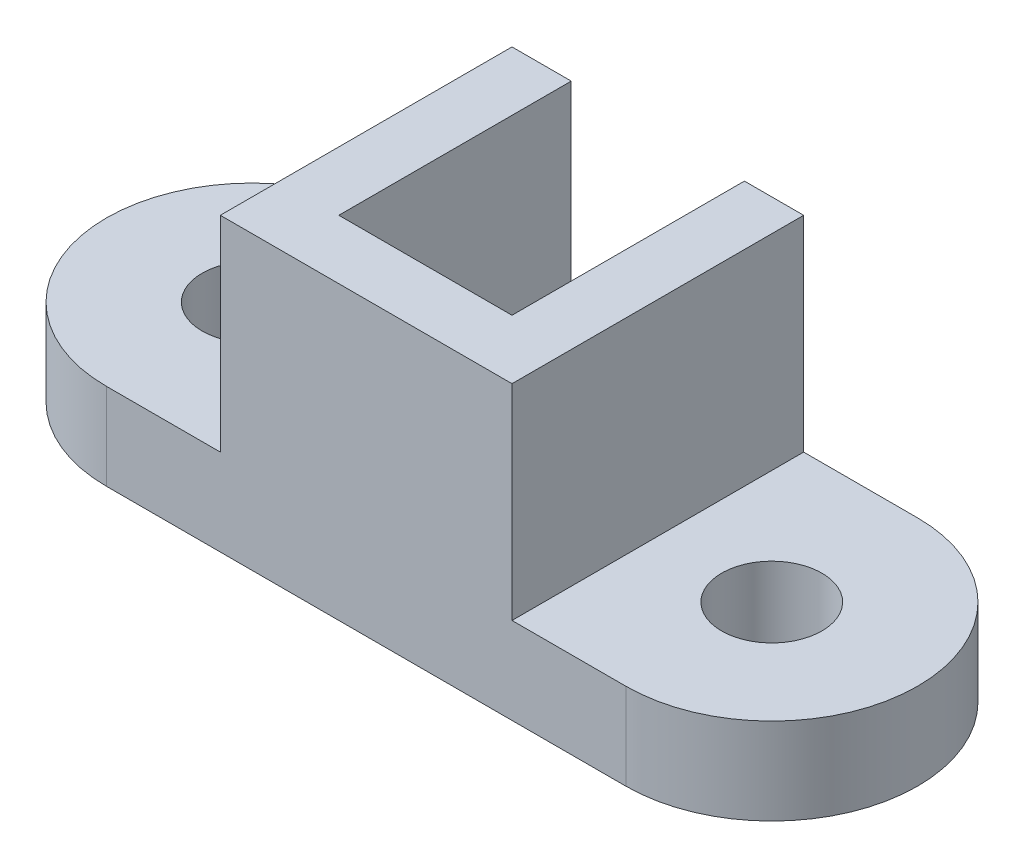
ISO-10303-21;
HEADER;
FILE_DESCRIPTION(('STEP AP214'),'2;1');
FILE_NAME('part.step','',(''),(''),'','','');
FILE_SCHEMA(('AUTOMOTIVE_DESIGN { 1 0 10303 214 1 1 1 1 }'));
ENDSEC;
DATA;
#1=APPLICATION_CONTEXT('core data for automotive mechanical design processes');
#2=APPLICATION_PROTOCOL_DEFINITION('international standard','automotive_design',2000,#1);
#3=PRODUCT_CONTEXT('',#1,'mechanical');
#4=PRODUCT('Part','Part','',(#3));
#5=PRODUCT_RELATED_PRODUCT_CATEGORY('part','',(#4));
#6=PRODUCT_DEFINITION_FORMATION('','',#4);
#7=PRODUCT_DEFINITION_CONTEXT('part definition',#1,'design');
#8=PRODUCT_DEFINITION('design','',#6,#7);
#9=PRODUCT_DEFINITION_SHAPE('','',#8);
#10=(LENGTH_UNIT() NAMED_UNIT(*) SI_UNIT(.MILLI.,.METRE.));
#11=(NAMED_UNIT(*) PLANE_ANGLE_UNIT() SI_UNIT($,.RADIAN.));
#12=(NAMED_UNIT(*) SI_UNIT($,.STERADIAN.) SOLID_ANGLE_UNIT());
#13=UNCERTAINTY_MEASURE_WITH_UNIT(LENGTH_MEASURE(1.E-05),#10,'distance_accuracy_value','');
#14=(GEOMETRIC_REPRESENTATION_CONTEXT(3) GLOBAL_UNCERTAINTY_ASSIGNED_CONTEXT((#13)) GLOBAL_UNIT_ASSIGNED_CONTEXT((#10,
#11,#12)) REPRESENTATION_CONTEXT('',''));
#15=CARTESIAN_POINT('',(0.,0.,0.));
#16=DIRECTION('',(0.,0.,1.));
#17=DIRECTION('',(1.,0.,0.));
#18=AXIS2_PLACEMENT_3D('',#15,#16,#17);
#19=CARTESIAN_POINT('',(0.,19.,0.));
#20=DIRECTION('',(0.,1.,0.));
#21=DIRECTION('',(0.,0.,1.));
#22=AXIS2_PLACEMENT_3D('',#19,#20,#21);
#23=PLANE('',#22);
#24=CARTESIAN_POINT('',(114.,19.,0.));
#25=DIRECTION('',(0.,1.,0.));
#26=DIRECTION('',(0.,0.,1.));
#27=AXIS2_PLACEMENT_3D('',#24,#25,#26);
#28=CIRCLE('',#27,11.);
#29=CARTESIAN_POINT('',(114.,19.,11.));
#30=VERTEX_POINT('',#29);
#31=EDGE_CURVE('E260',#30,#30,#28,.T.);
#32=ORIENTED_EDGE('',*,*,#31,.F.);
#33=EDGE_LOOP('',(#32));
#34=FACE_BOUND('',#33,.T.);
#35=DIRECTION('',(0.,0.,-1.));
#36=VECTOR('',#35,1.);
#37=CARTESIAN_POINT('',(89.,19.,-32.));
#38=LINE('',#37,#36);
#39=CARTESIAN_POINT('',(89.,19.,32.));
#40=VERTEX_POINT('',#39);
#41=CARTESIAN_POINT('',(89.,19.,-32.));
#42=VERTEX_POINT('',#41);
#43=EDGE_CURVE('E138',#40,#42,#38,.T.);
#44=ORIENTED_EDGE('',*,*,#43,.F.);
#45=DIRECTION('',(1.,0.,0.));
#46=VECTOR('',#45,1.);
#47=CARTESIAN_POINT('',(0.,19.,32.));
#48=LINE('',#47,#46);
#49=CARTESIAN_POINT('',(114.,19.,32.));
#50=VERTEX_POINT('',#49);
#51=EDGE_CURVE('E172',#40,#50,#48,.T.);
#52=ORIENTED_EDGE('',*,*,#51,.T.);
#53=CARTESIAN_POINT('',(114.,19.,0.));
#54=DIRECTION('',(0.,1.,0.));
#55=DIRECTION('',(0.,0.,1.));
#56=AXIS2_PLACEMENT_3D('',#53,#54,#55);
#57=CIRCLE('',#56,32.);
#58=CARTESIAN_POINT('',(114.,19.,-32.));
#59=VERTEX_POINT('',#58);
#60=EDGE_CURVE('E176',#50,#59,#57,.T.);
#61=ORIENTED_EDGE('',*,*,#60,.T.);
#62=DIRECTION('',(-1.,0.,0.));
#63=VECTOR('',#62,1.);
#64=CARTESIAN_POINT('',(0.,19.,-32.));
#65=LINE('',#64,#63);
#66=EDGE_CURVE('E179',#59,#42,#65,.T.);
#67=ORIENTED_EDGE('',*,*,#66,.T.);
#68=EDGE_LOOP('',(#44,#52,#61,#67));
#69=FACE_BOUND('',#68,.T.);
#70=ADVANCED_FACE('F33',(#34,#69),#23,.T.);
#71=CARTESIAN_POINT('',(0.,19.,0.));
#72=DIRECTION('',(0.,-1.,0.));
#73=DIRECTION('',(0.,0.,-1.));
#74=AXIS2_PLACEMENT_3D('',#71,#72,#73);
#75=CYLINDRICAL_SURFACE('',#74,32.);
#76=CARTESIAN_POINT('',(0.,0.,0.));
#77=DIRECTION('',(0.,1.,0.));
#78=DIRECTION('',(0.,0.,1.));
#79=AXIS2_PLACEMENT_3D('',#76,#77,#78);
#80=CIRCLE('',#79,32.);
#81=CARTESIAN_POINT('',(0.,0.,-32.));
#82=VERTEX_POINT('',#81);
#83=CARTESIAN_POINT('',(0.,0.,32.));
#84=VERTEX_POINT('',#83);
#85=EDGE_CURVE('E168',#82,#84,#80,.T.);
#86=ORIENTED_EDGE('',*,*,#85,.T.);
#87=DIRECTION('',(0.,-1.,0.));
#88=VECTOR('',#87,1.);
#89=CARTESIAN_POINT('',(0.,19.,32.));
#90=LINE('',#89,#88);
#91=CARTESIAN_POINT('',(0.,19.,32.));
#92=VERTEX_POINT('',#91);
#93=EDGE_CURVE('E11',#92,#84,#90,.T.);
#94=ORIENTED_EDGE('',*,*,#93,.F.);
#95=CARTESIAN_POINT('',(0.,19.,0.));
#96=DIRECTION('',(0.,1.,0.));
#97=DIRECTION('',(0.,0.,1.));
#98=AXIS2_PLACEMENT_3D('',#95,#96,#97);
#99=CIRCLE('',#98,32.);
#100=CARTESIAN_POINT('',(0.,19.,-32.));
#101=VERTEX_POINT('',#100);
#102=EDGE_CURVE('E169',#101,#92,#99,.T.);
#103=ORIENTED_EDGE('',*,*,#102,.F.);
#104=DIRECTION('',(0.,-1.,0.));
#105=VECTOR('',#104,1.);
#106=CARTESIAN_POINT('',(0.,19.,-32.));
#107=LINE('',#106,#105);
#108=EDGE_CURVE('E181',#101,#82,#107,.T.);
#109=ORIENTED_EDGE('',*,*,#108,.T.);
#110=EDGE_LOOP('',(#86,#94,#103,#109));
#111=FACE_BOUND('',#110,.T.);
#112=ADVANCED_FACE('F35',(#111),#75,.T.);
#113=CARTESIAN_POINT('',(0.,19.,32.));
#114=DIRECTION('',(0.,0.,-1.));
#115=DIRECTION('',(-1.,0.,0.));
#116=AXIS2_PLACEMENT_3D('',#113,#114,#115);
#117=PLANE('',#116);
#118=DIRECTION('',(1.,0.,0.));
#119=VECTOR('',#118,1.);
#120=CARTESIAN_POINT('',(0.,0.,32.));
#121=LINE('',#120,#119);
#122=CARTESIAN_POINT('',(114.,0.,32.));
#123=VERTEX_POINT('',#122);
#124=EDGE_CURVE('E184',#84,#123,#121,.T.);
#125=ORIENTED_EDGE('',*,*,#124,.T.);
#126=DIRECTION('',(0.,-1.,0.));
#127=VECTOR('',#126,1.);
#128=CARTESIAN_POINT('',(114.,19.,32.));
#129=LINE('',#128,#127);
#130=EDGE_CURVE('E41',#50,#123,#129,.T.);
#131=ORIENTED_EDGE('',*,*,#130,.F.);
#132=ORIENTED_EDGE('',*,*,#51,.F.);
#133=DIRECTION('',(0.,-1.,0.));
#134=VECTOR('',#133,1.);
#135=CARTESIAN_POINT('',(89.,64.,32.));
#136=LINE('',#135,#134);
#137=CARTESIAN_POINT('',(89.,64.,32.));
#138=VERTEX_POINT('',#137);
#139=EDGE_CURVE('E153',#138,#40,#136,.T.);
#140=ORIENTED_EDGE('',*,*,#139,.F.);
#141=DIRECTION('',(1.,0.,0.));
#142=VECTOR('',#141,1.);
#143=CARTESIAN_POINT('',(25.,64.,32.));
#144=LINE('',#143,#142);
#145=CARTESIAN_POINT('',(25.,64.,32.));
#146=VERTEX_POINT('',#145);
#147=EDGE_CURVE('E151',#146,#138,#144,.T.);
#148=ORIENTED_EDGE('',*,*,#147,.F.);
#149=DIRECTION('',(0.,-1.,0.));
#150=VECTOR('',#149,1.);
#151=CARTESIAN_POINT('',(25.,64.,32.));
#152=LINE('',#151,#150);
#153=CARTESIAN_POINT('',(25.,19.,32.));
#154=VERTEX_POINT('',#153);
#155=EDGE_CURVE('E159',#146,#154,#152,.T.);
#156=ORIENTED_EDGE('',*,*,#155,.T.);
#157=EDGE_CURVE('E174',#92,#154,#48,.T.);
#158=ORIENTED_EDGE('',*,*,#157,.F.);
#159=ORIENTED_EDGE('',*,*,#93,.T.);
#160=EDGE_LOOP('',(#125,#131,#132,#140,#148,#156,#158,#159));
#161=FACE_BOUND('',#160,.T.);
#162=ADVANCED_FACE('F227',(#161),#117,.F.);
#163=CARTESIAN_POINT('',(114.,19.,0.));
#164=DIRECTION('',(0.,-1.,0.));
#165=DIRECTION('',(0.,0.,-1.));
#166=AXIS2_PLACEMENT_3D('',#163,#164,#165);
#167=CYLINDRICAL_SURFACE('',#166,32.);
#168=CARTESIAN_POINT('',(114.,0.,0.));
#169=DIRECTION('',(0.,1.,0.));
#170=DIRECTION('',(0.,0.,1.));
#171=AXIS2_PLACEMENT_3D('',#168,#169,#170);
#172=CIRCLE('',#171,32.);
#173=CARTESIAN_POINT('',(114.,0.,-32.));
#174=VERTEX_POINT('',#173);
#175=EDGE_CURVE('E186',#123,#174,#172,.T.);
#176=ORIENTED_EDGE('',*,*,#175,.T.);
#177=DIRECTION('',(0.,-1.,0.));
#178=VECTOR('',#177,1.);
#179=CARTESIAN_POINT('',(114.,19.,-32.));
#180=LINE('',#179,#178);
#181=EDGE_CURVE('E191',#59,#174,#180,.T.);
#182=ORIENTED_EDGE('',*,*,#181,.F.);
#183=ORIENTED_EDGE('',*,*,#60,.F.);
#184=ORIENTED_EDGE('',*,*,#130,.T.);
#185=EDGE_LOOP('',(#176,#182,#183,#184));
#186=FACE_BOUND('',#185,.T.);
#187=ADVANCED_FACE('F198',(#186),#167,.T.);
#188=CARTESIAN_POINT('',(0.,19.,-32.));
#189=DIRECTION('',(0.,0.,1.));
#190=DIRECTION('',(1.,0.,0.));
#191=AXIS2_PLACEMENT_3D('',#188,#189,#190);
#192=PLANE('',#191);
#193=DIRECTION('',(-1.,0.,0.));
#194=VECTOR('',#193,1.);
#195=CARTESIAN_POINT('',(25.,64.,-32.));
#196=LINE('',#195,#194);
#197=CARTESIAN_POINT('',(38.,64.,-32.));
#198=VERTEX_POINT('',#197);
#199=CARTESIAN_POINT('',(25.,64.,-32.));
#200=VERTEX_POINT('',#199);
#201=EDGE_CURVE('E146',#198,#200,#196,.T.);
#202=ORIENTED_EDGE('',*,*,#201,.F.);
#203=DIRECTION('',(0.,1.,0.));
#204=VECTOR('',#203,1.);
#205=CARTESIAN_POINT('',(38.,13.,-32.));
#206=LINE('',#205,#204);
#207=CARTESIAN_POINT('',(38.,13.,-32.));
#208=VERTEX_POINT('',#207);
#209=EDGE_CURVE('E125',#208,#198,#206,.T.);
#210=ORIENTED_EDGE('',*,*,#209,.F.);
#211=DIRECTION('',(1.,0.,0.));
#212=VECTOR('',#211,1.);
#213=CARTESIAN_POINT('',(38.,13.,-32.));
#214=LINE('',#213,#212);
#215=CARTESIAN_POINT('',(76.,13.,-32.));
#216=VERTEX_POINT('',#215);
#217=EDGE_CURVE('E122',#208,#216,#214,.T.);
#218=ORIENTED_EDGE('',*,*,#217,.T.);
#219=DIRECTION('',(0.,1.,0.));
#220=VECTOR('',#219,1.);
#221=CARTESIAN_POINT('',(76.,13.,-32.));
#222=LINE('',#221,#220);
#223=CARTESIAN_POINT('',(76.,64.,-32.));
#224=VERTEX_POINT('',#223);
#225=EDGE_CURVE('E132',#216,#224,#222,.T.);
#226=ORIENTED_EDGE('',*,*,#225,.T.);
#227=CARTESIAN_POINT('',(89.,64.,-32.));
#228=VERTEX_POINT('',#227);
#229=EDGE_CURVE('E147',#228,#224,#196,.T.);
#230=ORIENTED_EDGE('',*,*,#229,.F.);
#231=DIRECTION('',(0.,-1.,0.));
#232=VECTOR('',#231,1.);
#233=CARTESIAN_POINT('',(89.,64.,-32.));
#234=LINE('',#233,#232);
#235=EDGE_CURVE('E165',#228,#42,#234,.T.);
#236=ORIENTED_EDGE('',*,*,#235,.T.);
#237=ORIENTED_EDGE('',*,*,#66,.F.);
#238=ORIENTED_EDGE('',*,*,#181,.T.);
#239=DIRECTION('',(-1.,0.,0.));
#240=VECTOR('',#239,1.);
#241=CARTESIAN_POINT('',(0.,0.,-32.));
#242=LINE('',#241,#240);
#243=EDGE_CURVE('E173',#174,#82,#242,.T.);
#244=ORIENTED_EDGE('',*,*,#243,.T.);
#245=ORIENTED_EDGE('',*,*,#108,.F.);
#246=CARTESIAN_POINT('',(25.,19.,-32.));
#247=VERTEX_POINT('',#246);
#248=EDGE_CURVE('E178',#247,#101,#65,.T.);
#249=ORIENTED_EDGE('',*,*,#248,.F.);
#250=DIRECTION('',(0.,-1.,0.));
#251=VECTOR('',#250,1.);
#252=CARTESIAN_POINT('',(25.,64.,-32.));
#253=LINE('',#252,#251);
#254=EDGE_CURVE('E162',#200,#247,#253,.T.);
#255=ORIENTED_EDGE('',*,*,#254,.F.);
#256=EDGE_LOOP('',(#202,#210,#218,#226,#230,#236,#237,#238,#244,#245,#249,#255));
#257=FACE_BOUND('',#256,.T.);
#258=ADVANCED_FACE('F208',(#257),#192,.F.);
#259=CARTESIAN_POINT('',(0.,19.,0.));
#260=DIRECTION('',(0.,1.,0.));
#261=DIRECTION('',(0.,0.,1.));
#262=AXIS2_PLACEMENT_3D('',#259,#260,#261);
#263=CIRCLE('',#262,11.);
#264=CARTESIAN_POINT('',(0.,19.,11.));
#265=VERTEX_POINT('',#264);
#266=EDGE_CURVE('E252',#265,#265,#263,.T.);
#267=ORIENTED_EDGE('',*,*,#266,.F.);
#268=EDGE_LOOP('',(#267));
#269=FACE_BOUND('',#268,.T.);
#270=DIRECTION('',(0.,0.,1.));
#271=VECTOR('',#270,1.);
#272=CARTESIAN_POINT('',(25.,19.,-32.));
#273=LINE('',#272,#271);
#274=EDGE_CURVE('E56',#247,#154,#273,.T.);
#275=ORIENTED_EDGE('',*,*,#274,.F.);
#276=ORIENTED_EDGE('',*,*,#248,.T.);
#277=ORIENTED_EDGE('',*,*,#102,.T.);
#278=ORIENTED_EDGE('',*,*,#157,.T.);
#279=EDGE_LOOP('',(#275,#276,#277,#278));
#280=FACE_BOUND('',#279,.T.);
#281=ADVANCED_FACE('F213',(#269,#280),#23,.T.);
#282=CARTESIAN_POINT('',(0.,0.,0.));
#283=DIRECTION('',(0.,1.,0.));
#284=DIRECTION('',(0.,0.,1.));
#285=AXIS2_PLACEMENT_3D('',#282,#283,#284);
#286=PLANE('',#285);
#287=CARTESIAN_POINT('',(114.,0.,0.));
#288=DIRECTION('',(0.,1.,0.));
#289=DIRECTION('',(0.,0.,1.));
#290=AXIS2_PLACEMENT_3D('',#287,#288,#289);
#291=CIRCLE('',#290,11.);
#292=CARTESIAN_POINT('',(114.,0.,11.));
#293=VERTEX_POINT('',#292);
#294=EDGE_CURVE('E255',#293,#293,#291,.T.);
#295=ORIENTED_EDGE('',*,*,#294,.T.);
#296=EDGE_LOOP('',(#295));
#297=FACE_BOUND('',#296,.T.);
#298=CARTESIAN_POINT('',(0.,0.,0.));
#299=DIRECTION('',(0.,1.,0.));
#300=DIRECTION('',(0.,0.,1.));
#301=AXIS2_PLACEMENT_3D('',#298,#299,#300);
#302=CIRCLE('',#301,11.);
#303=CARTESIAN_POINT('',(0.,0.,11.));
#304=VERTEX_POINT('',#303);
#305=EDGE_CURVE('E254',#304,#304,#302,.T.);
#306=ORIENTED_EDGE('',*,*,#305,.T.);
#307=EDGE_LOOP('',(#306));
#308=FACE_BOUND('',#307,.T.);
#309=ORIENTED_EDGE('',*,*,#85,.F.);
#310=ORIENTED_EDGE('',*,*,#243,.F.);
#311=ORIENTED_EDGE('',*,*,#175,.F.);
#312=ORIENTED_EDGE('',*,*,#124,.F.);
#313=EDGE_LOOP('',(#309,#310,#311,#312));
#314=FACE_BOUND('',#313,.T.);
#315=ADVANCED_FACE('F205',(#297,#308,#314),#286,.F.);
#316=CARTESIAN_POINT('',(89.,64.,-32.));
#317=DIRECTION('',(-1.,0.,0.));
#318=DIRECTION('',(0.,0.,1.));
#319=AXIS2_PLACEMENT_3D('',#316,#317,#318);
#320=PLANE('',#319);
#321=ORIENTED_EDGE('',*,*,#43,.T.);
#322=ORIENTED_EDGE('',*,*,#235,.F.);
#323=DIRECTION('',(0.,0.,-1.));
#324=VECTOR('',#323,1.);
#325=CARTESIAN_POINT('',(89.,64.,-32.));
#326=LINE('',#325,#324);
#327=EDGE_CURVE('E143',#138,#228,#326,.T.);
#328=ORIENTED_EDGE('',*,*,#327,.F.);
#329=ORIENTED_EDGE('',*,*,#139,.T.);
#330=EDGE_LOOP('',(#321,#322,#328,#329));
#331=FACE_BOUND('',#330,.T.);
#332=ADVANCED_FACE('F225',(#331),#320,.F.);
#333=CARTESIAN_POINT('',(25.,64.,-32.));
#334=DIRECTION('',(1.,0.,0.));
#335=DIRECTION('',(0.,0.,-1.));
#336=AXIS2_PLACEMENT_3D('',#333,#334,#335);
#337=PLANE('',#336);
#338=ORIENTED_EDGE('',*,*,#274,.T.);
#339=ORIENTED_EDGE('',*,*,#155,.F.);
#340=DIRECTION('',(0.,0.,1.));
#341=VECTOR('',#340,1.);
#342=CARTESIAN_POINT('',(25.,64.,-32.));
#343=LINE('',#342,#341);
#344=EDGE_CURVE('E149',#200,#146,#343,.T.);
#345=ORIENTED_EDGE('',*,*,#344,.F.);
#346=ORIENTED_EDGE('',*,*,#254,.T.);
#347=EDGE_LOOP('',(#338,#339,#345,#346));
#348=FACE_BOUND('',#347,.T.);
#349=ADVANCED_FACE('F217',(#348),#337,.F.);
#350=CARTESIAN_POINT('',(0.,64.,0.));
#351=DIRECTION('',(0.,1.,0.));
#352=DIRECTION('',(0.,0.,1.));
#353=AXIS2_PLACEMENT_3D('',#350,#351,#352);
#354=PLANE('',#353);
#355=DIRECTION('',(0.,0.,1.));
#356=VECTOR('',#355,1.);
#357=CARTESIAN_POINT('',(38.,64.,-32.));
#358=LINE('',#357,#356);
#359=CARTESIAN_POINT('',(38.,64.,19.));
#360=VERTEX_POINT('',#359);
#361=EDGE_CURVE('E126',#198,#360,#358,.T.);
#362=ORIENTED_EDGE('',*,*,#361,.F.);
#363=ORIENTED_EDGE('',*,*,#201,.T.);
#364=ORIENTED_EDGE('',*,*,#344,.T.);
#365=ORIENTED_EDGE('',*,*,#147,.T.);
#366=ORIENTED_EDGE('',*,*,#327,.T.);
#367=ORIENTED_EDGE('',*,*,#229,.T.);
#368=DIRECTION('',(0.,0.,1.));
#369=VECTOR('',#368,1.);
#370=CARTESIAN_POINT('',(76.,64.,-32.));
#371=LINE('',#370,#369);
#372=CARTESIAN_POINT('',(76.,64.,19.));
#373=VERTEX_POINT('',#372);
#374=EDGE_CURVE('E136',#224,#373,#371,.T.);
#375=ORIENTED_EDGE('',*,*,#374,.T.);
#376=DIRECTION('',(1.,0.,0.));
#377=VECTOR('',#376,1.);
#378=CARTESIAN_POINT('',(38.,64.,19.));
#379=LINE('',#378,#377);
#380=EDGE_CURVE('E119',#360,#373,#379,.T.);
#381=ORIENTED_EDGE('',*,*,#380,.F.);
#382=EDGE_LOOP('',(#362,#363,#364,#365,#366,#367,#375,#381));
#383=FACE_BOUND('',#382,.T.);
#384=ADVANCED_FACE('F134',(#383),#354,.T.);
#385=CARTESIAN_POINT('',(38.,64.,19.));
#386=DIRECTION('',(0.,-0.707106781186548,0.707106781186548));
#387=DIRECTION('',(0.,-0.707106781186548,-0.707106781186548));
#388=AXIS2_PLACEMENT_3D('',#385,#386,#387);
#389=PLANE('',#388);
#390=DIRECTION('',(0.,-0.707106781186547,-0.707106781186547));
#391=VECTOR('',#390,1.);
#392=CARTESIAN_POINT('',(76.,64.,19.));
#393=LINE('',#392,#391);
#394=EDGE_CURVE('E48',#373,#216,#393,.T.);
#395=ORIENTED_EDGE('',*,*,#394,.T.);
#396=ORIENTED_EDGE('',*,*,#217,.F.);
#397=DIRECTION('',(0.,-0.707106781186547,-0.707106781186547));
#398=VECTOR('',#397,1.);
#399=CARTESIAN_POINT('',(38.,64.,19.));
#400=LINE('',#399,#398);
#401=EDGE_CURVE('E115',#360,#208,#400,.T.);
#402=ORIENTED_EDGE('',*,*,#401,.F.);
#403=ORIENTED_EDGE('',*,*,#380,.T.);
#404=EDGE_LOOP('',(#395,#396,#402,#403));
#405=FACE_BOUND('',#404,.T.);
#406=ADVANCED_FACE('F117',(#405),#389,.F.);
#407=CARTESIAN_POINT('',(38.,0.,0.));
#408=DIRECTION('',(-1.,0.,0.));
#409=DIRECTION('',(0.,0.,1.));
#410=AXIS2_PLACEMENT_3D('',#407,#408,#409);
#411=PLANE('',#410);
#412=ORIENTED_EDGE('',*,*,#361,.T.);
#413=ORIENTED_EDGE('',*,*,#401,.T.);
#414=ORIENTED_EDGE('',*,*,#209,.T.);
#415=EDGE_LOOP('',(#412,#413,#414));
#416=FACE_BOUND('',#415,.T.);
#417=ADVANCED_FACE('F129',(#416),#411,.F.);
#418=CARTESIAN_POINT('',(76.,0.,0.));
#419=DIRECTION('',(-1.,0.,0.));
#420=DIRECTION('',(0.,0.,1.));
#421=AXIS2_PLACEMENT_3D('',#418,#419,#420);
#422=PLANE('',#421);
#423=ORIENTED_EDGE('',*,*,#374,.F.);
#424=ORIENTED_EDGE('',*,*,#225,.F.);
#425=ORIENTED_EDGE('',*,*,#394,.F.);
#426=EDGE_LOOP('',(#423,#424,#425));
#427=FACE_BOUND('',#426,.T.);
#428=ADVANCED_FACE('F275',(#427),#422,.T.);
#429=CARTESIAN_POINT('',(0.,0.,0.));
#430=DIRECTION('',(0.,1.,0.));
#431=DIRECTION('',(0.,0.,1.));
#432=AXIS2_PLACEMENT_3D('',#429,#430,#431);
#433=CYLINDRICAL_SURFACE('',#432,11.);
#434=ORIENTED_EDGE('',*,*,#305,.F.);
#435=EDGE_LOOP('',(#434));
#436=FACE_BOUND('',#435,.T.);
#437=ORIENTED_EDGE('',*,*,#266,.T.);
#438=EDGE_LOOP('',(#437));
#439=FACE_BOUND('',#438,.T.);
#440=ADVANCED_FACE('F269',(#436,#439),#433,.F.);
#441=CARTESIAN_POINT('',(114.,0.,0.));
#442=DIRECTION('',(0.,1.,0.));
#443=DIRECTION('',(0.,0.,1.));
#444=AXIS2_PLACEMENT_3D('',#441,#442,#443);
#445=CYLINDRICAL_SURFACE('',#444,11.);
#446=ORIENTED_EDGE('',*,*,#294,.F.);
#447=EDGE_LOOP('',(#446));
#448=FACE_BOUND('',#447,.T.);
#449=ORIENTED_EDGE('',*,*,#31,.T.);
#450=EDGE_LOOP('',(#449));
#451=FACE_BOUND('',#450,.T.);
#452=ADVANCED_FACE('F267',(#448,#451),#445,.F.);
#453=CLOSED_SHELL('',(#70,#112,#162,#187,#258,#281,#315,#332,#349,#384,#406,#417,#428,#440,#452));
#454=MANIFOLD_SOLID_BREP('B2',#453);
#455=ADVANCED_BREP_SHAPE_REPRESENTATION('',(#18,#454),#14);
#456=SHAPE_DEFINITION_REPRESENTATION(#9,#455);
ENDSEC;
END-ISO-10303-21;
